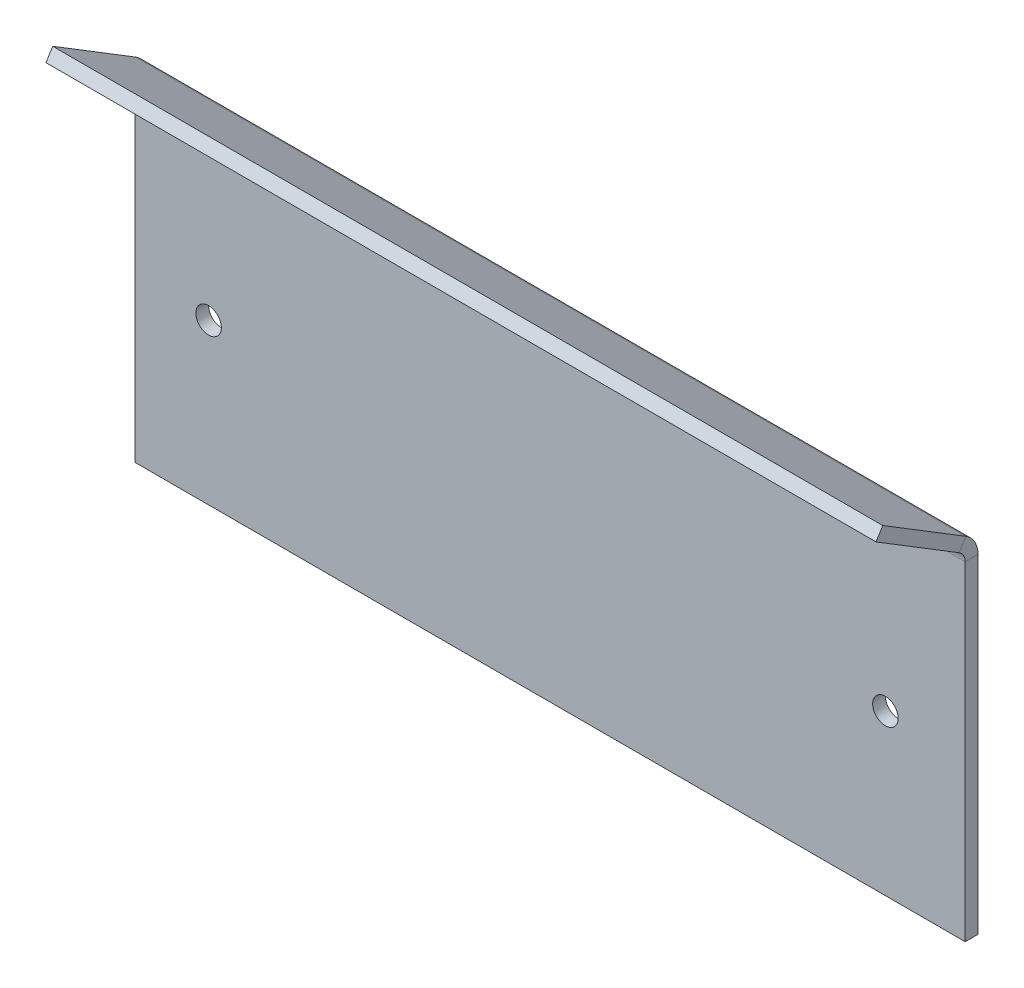
ISO-10303-21;
HEADER;
FILE_DESCRIPTION(('STEP AP214'),'2;1');
FILE_NAME('part.step','',(''),(''),'','','');
FILE_SCHEMA(('AUTOMOTIVE_DESIGN { 1 0 10303 214 1 1 1 1 }'));
ENDSEC;
DATA;
#1=APPLICATION_CONTEXT('core data for automotive mechanical design processes');
#2=APPLICATION_PROTOCOL_DEFINITION('international standard','automotive_design',2000,#1);
#3=PRODUCT_CONTEXT('',#1,'mechanical');
#4=PRODUCT('Part','Part','',(#3));
#5=PRODUCT_RELATED_PRODUCT_CATEGORY('part','',(#4));
#6=PRODUCT_DEFINITION_FORMATION('','',#4);
#7=PRODUCT_DEFINITION_CONTEXT('part definition',#1,'design');
#8=PRODUCT_DEFINITION('design','',#6,#7);
#9=PRODUCT_DEFINITION_SHAPE('','',#8);
#10=(LENGTH_UNIT() NAMED_UNIT(*) SI_UNIT(.MILLI.,.METRE.));
#11=(NAMED_UNIT(*) PLANE_ANGLE_UNIT() SI_UNIT($,.RADIAN.));
#12=(NAMED_UNIT(*) SI_UNIT($,.STERADIAN.) SOLID_ANGLE_UNIT());
#13=UNCERTAINTY_MEASURE_WITH_UNIT(LENGTH_MEASURE(1.E-05),#10,'distance_accuracy_value','');
#14=(GEOMETRIC_REPRESENTATION_CONTEXT(3) GLOBAL_UNCERTAINTY_ASSIGNED_CONTEXT((#13)) GLOBAL_UNIT_ASSIGNED_CONTEXT((#10,
#11,#12)) REPRESENTATION_CONTEXT('',''));
#15=CARTESIAN_POINT('',(0.,0.,0.));
#16=DIRECTION('',(0.,0.,1.));
#17=DIRECTION('',(1.,0.,0.));
#18=AXIS2_PLACEMENT_3D('',#15,#16,#17);
#19=CARTESIAN_POINT('',(-153.944751381215,30.6464088397789,-4.00000000000023));
#20=DIRECTION('',(-1.,0.,0.));
#21=DIRECTION('',(0.,0.,1.));
#22=AXIS2_PLACEMENT_3D('',#19,#20,#21);
#23=PLANE('',#22);
#24=DIRECTION('',(0.,-1.,0.));
#25=VECTOR('',#24,1.);
#26=CARTESIAN_POINT('',(-153.944751381215,30.6464088397789,-2.22044604925031E-13));
#27=LINE('',#26,#25);
#28=CARTESIAN_POINT('',(-153.944751381216,23.7149904194265,8.88178419700125E-13));
#29=VERTEX_POINT('',#28);
#30=CARTESIAN_POINT('',(-153.944751381215,-79.3535911602214,0.));
#31=VERTEX_POINT('',#30);
#32=EDGE_CURVE('E108',#29,#31,#27,.T.);
#33=ORIENTED_EDGE('',*,*,#32,.F.);
#34=DIRECTION('',(0.,0.,-1.));
#35=VECTOR('',#34,1.);
#36=CARTESIAN_POINT('',(-153.944751381216,23.7149904194265,8.88178419700125E-13));
#37=LINE('',#36,#35);
#38=CARTESIAN_POINT('',(-153.944751381216,23.7149904194266,-3.99999999999978));
#39=VERTEX_POINT('',#38);
#40=EDGE_CURVE('E174',#29,#39,#37,.T.);
#41=ORIENTED_EDGE('',*,*,#40,.T.);
#42=DIRECTION('',(0.,-1.,0.));
#43=VECTOR('',#42,1.);
#44=CARTESIAN_POINT('',(-153.944751381215,30.6464088397789,-4.00000000000023));
#45=LINE('',#44,#43);
#46=CARTESIAN_POINT('',(-153.944751381215,-79.3535911602211,-4.));
#47=VERTEX_POINT('',#46);
#48=EDGE_CURVE('E115',#39,#47,#45,.T.);
#49=ORIENTED_EDGE('',*,*,#48,.T.);
#50=DIRECTION('',(0.,0.,1.));
#51=VECTOR('',#50,1.);
#52=CARTESIAN_POINT('',(-153.944751381215,-79.3535911602211,-4.));
#53=LINE('',#52,#51);
#54=EDGE_CURVE('E67',#47,#31,#53,.T.);
#55=ORIENTED_EDGE('',*,*,#54,.T.);
#56=EDGE_LOOP('',(#33,#41,#49,#55));
#57=FACE_BOUND('',#56,.T.);
#58=ADVANCED_FACE('F58',(#57),#23,.T.);
#59=CARTESIAN_POINT('',(0.,-1.11022302462516E-13,-4.));
#60=DIRECTION('',(0.,0.,-1.));
#61=DIRECTION('',(-1.,0.,0.));
#62=AXIS2_PLACEMENT_3D('',#59,#60,#61);
#63=PLANE('',#62);
#64=CARTESIAN_POINT('',(-130.944751381216,-29.2850095805735,-4.));
#65=DIRECTION('',(0.,0.,-1.));
#66=DIRECTION('',(-1.,0.,0.));
#67=AXIS2_PLACEMENT_3D('',#64,#65,#66);
#68=CIRCLE('',#67,3.99999999999999);
#69=CARTESIAN_POINT('',(-134.944751381216,-29.2850095805735,-4.));
#70=VERTEX_POINT('',#69);
#71=EDGE_CURVE('E133',#70,#70,#68,.T.);
#72=ORIENTED_EDGE('',*,*,#71,.F.);
#73=EDGE_LOOP('',(#72));
#74=FACE_BOUND('',#73,.T.);
#75=CARTESIAN_POINT('',(81.0552486187845,-29.2850095805735,-4.));
#76=DIRECTION('',(0.,0.,-1.));
#77=DIRECTION('',(-1.,0.,0.));
#78=AXIS2_PLACEMENT_3D('',#75,#76,#77);
#79=CIRCLE('',#78,4.00000000000001);
#80=CARTESIAN_POINT('',(77.0552486187845,-29.2850095805735,-4.));
#81=VERTEX_POINT('',#80);
#82=EDGE_CURVE('E122',#81,#81,#79,.T.);
#83=ORIENTED_EDGE('',*,*,#82,.F.);
#84=EDGE_LOOP('',(#83));
#85=FACE_BOUND('',#84,.T.);
#86=ORIENTED_EDGE('',*,*,#48,.F.);
#87=DIRECTION('',(-1.,0.,0.));
#88=VECTOR('',#87,1.);
#89=CARTESIAN_POINT('',(-153.944751381216,23.7149904194266,-3.99999999999978));
#90=LINE('',#89,#88);
#91=CARTESIAN_POINT('',(106.055248618785,23.714990419427,-4.));
#92=VERTEX_POINT('',#91);
#93=EDGE_CURVE('E169',#39,#92,#90,.F.);
#94=ORIENTED_EDGE('',*,*,#93,.T.);
#95=DIRECTION('',(0.,1.,0.));
#96=VECTOR('',#95,1.);
#97=CARTESIAN_POINT('',(106.055248618785,30.646408839779,-4.));
#98=LINE('',#97,#96);
#99=CARTESIAN_POINT('',(106.055248618785,-79.353591160221,-4.));
#100=VERTEX_POINT('',#99);
#101=EDGE_CURVE('E113',#100,#92,#98,.T.);
#102=ORIENTED_EDGE('',*,*,#101,.F.);
#103=DIRECTION('',(1.,0.,0.));
#104=VECTOR('',#103,1.);
#105=CARTESIAN_POINT('',(106.055248618785,-79.353591160221,-4.));
#106=LINE('',#105,#104);
#107=EDGE_CURVE('E100',#47,#100,#106,.T.);
#108=ORIENTED_EDGE('',*,*,#107,.F.);
#109=EDGE_LOOP('',(#86,#94,#102,#108));
#110=FACE_BOUND('',#109,.T.);
#111=ADVANCED_FACE('F193',(#74,#85,#110),#63,.T.);
#112=CARTESIAN_POINT('',(0.,0.,0.));
#113=DIRECTION('',(0.,0.,-1.));
#114=DIRECTION('',(-1.,0.,0.));
#115=AXIS2_PLACEMENT_3D('',#112,#113,#114);
#116=PLANE('',#115);
#117=CARTESIAN_POINT('',(-130.944751381216,-29.2850095805735,0.));
#118=DIRECTION('',(0.,0.,-1.));
#119=DIRECTION('',(-1.,0.,0.));
#120=AXIS2_PLACEMENT_3D('',#117,#118,#119);
#121=CIRCLE('',#120,3.99999999999999);
#122=CARTESIAN_POINT('',(-134.944751381216,-29.2850095805735,0.));
#123=VERTEX_POINT('',#122);
#124=EDGE_CURVE('E62',#123,#123,#121,.T.);
#125=ORIENTED_EDGE('',*,*,#124,.T.);
#126=EDGE_LOOP('',(#125));
#127=FACE_BOUND('',#126,.T.);
#128=CARTESIAN_POINT('',(81.0552486187845,-29.2850095805739,0.));
#129=DIRECTION('',(0.,0.,-1.));
#130=DIRECTION('',(-1.,0.,0.));
#131=AXIS2_PLACEMENT_3D('',#128,#129,#130);
#132=CIRCLE('',#131,4.00000000000001);
#133=CARTESIAN_POINT('',(77.0552486187845,-29.2850095805739,0.));
#134=VERTEX_POINT('',#133);
#135=EDGE_CURVE('E119',#134,#134,#132,.T.);
#136=ORIENTED_EDGE('',*,*,#135,.T.);
#137=EDGE_LOOP('',(#136));
#138=FACE_BOUND('',#137,.T.);
#139=DIRECTION('',(-1.,0.,0.));
#140=VECTOR('',#139,1.);
#141=CARTESIAN_POINT('',(-153.944751381216,23.7149904194265,8.88178419700125E-13));
#142=LINE('',#141,#140);
#143=CARTESIAN_POINT('',(106.055248618785,23.7149904194266,0.));
#144=VERTEX_POINT('',#143);
#145=EDGE_CURVE('E180',#29,#144,#142,.F.);
#146=ORIENTED_EDGE('',*,*,#145,.F.);
#147=ORIENTED_EDGE('',*,*,#32,.T.);
#148=DIRECTION('',(1.,0.,0.));
#149=VECTOR('',#148,1.);
#150=CARTESIAN_POINT('',(106.055248618785,-79.353591160221,0.));
#151=LINE('',#150,#149);
#152=CARTESIAN_POINT('',(106.055248618785,-79.353591160221,0.));
#153=VERTEX_POINT('',#152);
#154=EDGE_CURVE('E98',#31,#153,#151,.T.);
#155=ORIENTED_EDGE('',*,*,#154,.T.);
#156=DIRECTION('',(0.,1.,0.));
#157=VECTOR('',#156,1.);
#158=CARTESIAN_POINT('',(106.055248618785,30.6464088397793,0.));
#159=LINE('',#158,#157);
#160=EDGE_CURVE('E103',#153,#144,#159,.T.);
#161=ORIENTED_EDGE('',*,*,#160,.T.);
#162=EDGE_LOOP('',(#146,#147,#155,#161));
#163=FACE_BOUND('',#162,.T.);
#164=ADVANCED_FACE('F110',(#127,#138,#163),#116,.F.);
#165=CARTESIAN_POINT('',(106.055248618785,30.646408839779,-4.));
#166=DIRECTION('',(1.,0.,0.));
#167=DIRECTION('',(0.,1.,0.));
#168=AXIS2_PLACEMENT_3D('',#165,#166,#167);
#169=PLANE('',#168);
#170=DIRECTION('',(0.,0.,-1.));
#171=VECTOR('',#170,1.);
#172=CARTESIAN_POINT('',(106.055248618785,23.7149904194266,0.));
#173=LINE('',#172,#171);
#174=EDGE_CURVE('E105',#144,#92,#173,.T.);
#175=ORIENTED_EDGE('',*,*,#174,.F.);
#176=ORIENTED_EDGE('',*,*,#160,.F.);
#177=DIRECTION('',(0.,0.,1.));
#178=VECTOR('',#177,1.);
#179=CARTESIAN_POINT('',(106.055248618785,-79.353591160221,-4.));
#180=LINE('',#179,#178);
#181=EDGE_CURVE('E13',#100,#153,#180,.T.);
#182=ORIENTED_EDGE('',*,*,#181,.F.);
#183=ORIENTED_EDGE('',*,*,#101,.T.);
#184=EDGE_LOOP('',(#175,#176,#182,#183));
#185=FACE_BOUND('',#184,.T.);
#186=ADVANCED_FACE('F60',(#185),#169,.T.);
#187=CARTESIAN_POINT('',(106.055248618785,-79.353591160221,-4.));
#188=DIRECTION('',(0.,-1.,0.));
#189=DIRECTION('',(1.,0.,0.));
#190=AXIS2_PLACEMENT_3D('',#187,#188,#189);
#191=PLANE('',#190);
#192=ORIENTED_EDGE('',*,*,#154,.F.);
#193=ORIENTED_EDGE('',*,*,#54,.F.);
#194=ORIENTED_EDGE('',*,*,#107,.T.);
#195=ORIENTED_EDGE('',*,*,#181,.T.);
#196=EDGE_LOOP('',(#192,#193,#194,#195));
#197=FACE_BOUND('',#196,.T.);
#198=ADVANCED_FACE('F95',(#197),#191,.T.);
#199=CARTESIAN_POINT('',(106.055248618785,23.7149904194269,4.));
#200=DIRECTION('',(1.,0.,0.));
#201=DIRECTION('',(0.,0.,-1.));
#202=AXIS2_PLACEMENT_3D('',#199,#200,#201);
#203=PLANE('',#202);
#204=DIRECTION('',(0.,0.85264016435409,-0.522498564715952));
#205=VECTOR('',#204,1.);
#206=CARTESIAN_POINT('',(106.055248618785,30.5361117342593,-0.179988517727603));
#207=LINE('',#206,#205);
#208=CARTESIAN_POINT('',(106.055248618785,27.1255510768433,1.91000574113631));
#209=VERTEX_POINT('',#208);
#210=CARTESIAN_POINT('',(106.055248618785,30.5361117342593,-0.179988517727603));
#211=VERTEX_POINT('',#210);
#212=EDGE_CURVE('E121',#209,#211,#207,.T.);
#213=ORIENTED_EDGE('',*,*,#212,.F.);
#214=CARTESIAN_POINT('',(106.055248618785,23.7149904194269,4.));
#215=DIRECTION('',(-1.,0.,0.));
#216=DIRECTION('',(0.,0.,1.));
#217=AXIS2_PLACEMENT_3D('',#214,#215,#216);
#218=CIRCLE('',#217,4.00000000000001);
#219=EDGE_CURVE('E177',#144,#209,#218,.F.);
#220=ORIENTED_EDGE('',*,*,#219,.F.);
#221=ORIENTED_EDGE('',*,*,#174,.T.);
#222=CARTESIAN_POINT('',(106.055248618785,23.7149904194269,4.));
#223=DIRECTION('',(-1.,0.,0.));
#224=DIRECTION('',(0.,0.,1.));
#225=AXIS2_PLACEMENT_3D('',#222,#223,#224);
#226=CIRCLE('',#225,8.00000000000001);
#227=EDGE_CURVE('E75',#92,#211,#226,.F.);
#228=ORIENTED_EDGE('',*,*,#227,.T.);
#229=EDGE_LOOP('',(#213,#220,#221,#228));
#230=FACE_BOUND('',#229,.T.);
#231=ADVANCED_FACE('F243',(#230),#203,.T.);
#232=CARTESIAN_POINT('',(-153.944751381216,23.7149904194266,4.00000000000089));
#233=DIRECTION('',(1.,0.,0.));
#234=DIRECTION('',(0.,0.,-1.));
#235=AXIS2_PLACEMENT_3D('',#232,#233,#234);
#236=PLANE('',#235);
#237=CARTESIAN_POINT('',(-153.944751381216,23.7149904194266,4.00000000000089));
#238=DIRECTION('',(-1.,0.,0.));
#239=DIRECTION('',(0.,0.,1.));
#240=AXIS2_PLACEMENT_3D('',#237,#238,#239);
#241=CIRCLE('',#240,4.00000000000001);
#242=CARTESIAN_POINT('',(-153.944751381215,27.125551076843,1.91000574113631));
#243=VERTEX_POINT('',#242);
#244=EDGE_CURVE('E139',#243,#29,#241,.T.);
#245=ORIENTED_EDGE('',*,*,#244,.F.);
#246=DIRECTION('',(0.,0.85264016435409,-0.522498564715952));
#247=VECTOR('',#246,1.);
#248=CARTESIAN_POINT('',(-153.944751381215,27.125551076843,1.91000574113631));
#249=LINE('',#248,#247);
#250=CARTESIAN_POINT('',(-153.944751381215,30.5361117342593,-0.179988517727603));
#251=VERTEX_POINT('',#250);
#252=EDGE_CURVE('E164',#243,#251,#249,.T.);
#253=ORIENTED_EDGE('',*,*,#252,.T.);
#254=CARTESIAN_POINT('',(-153.944751381216,23.7149904194266,4.00000000000089));
#255=DIRECTION('',(-1.,0.,0.));
#256=DIRECTION('',(0.,0.,1.));
#257=AXIS2_PLACEMENT_3D('',#254,#255,#256);
#258=CIRCLE('',#257,8.00000000000001);
#259=EDGE_CURVE('E172',#251,#39,#258,.T.);
#260=ORIENTED_EDGE('',*,*,#259,.T.);
#261=ORIENTED_EDGE('',*,*,#40,.F.);
#262=EDGE_LOOP('',(#245,#253,#260,#261));
#263=FACE_BOUND('',#262,.T.);
#264=ADVANCED_FACE('F201',(#263),#236,.F.);
#265=CARTESIAN_POINT('',(-153.944751381216,23.7149904194266,4.00000000000089));
#266=DIRECTION('',(-1.,0.,0.));
#267=DIRECTION('',(0.,0.85264016435409,-0.522498564715952));
#268=AXIS2_PLACEMENT_3D('',#265,#266,#267);
#269=CYLINDRICAL_SURFACE('',#268,8.00000000000001);
#270=ORIENTED_EDGE('',*,*,#93,.F.);
#271=ORIENTED_EDGE('',*,*,#259,.F.);
#272=DIRECTION('',(-1.,0.,0.));
#273=VECTOR('',#272,1.);
#274=CARTESIAN_POINT('',(0.,30.5361117342593,-0.179988517727603));
#275=LINE('',#274,#273);
#276=EDGE_CURVE('E161',#211,#251,#275,.T.);
#277=ORIENTED_EDGE('',*,*,#276,.F.);
#278=ORIENTED_EDGE('',*,*,#227,.F.);
#279=EDGE_LOOP('',(#270,#271,#277,#278));
#280=FACE_BOUND('',#279,.T.);
#281=ADVANCED_FACE('F195',(#280),#269,.T.);
#282=CARTESIAN_POINT('',(-153.944751381216,23.7149904194266,4.00000000000089));
#283=DIRECTION('',(-1.,0.,0.));
#284=DIRECTION('',(0.,0.85264016435409,-0.522498564715952));
#285=AXIS2_PLACEMENT_3D('',#282,#283,#284);
#286=CYLINDRICAL_SURFACE('',#285,4.00000000000001);
#287=ORIENTED_EDGE('',*,*,#145,.T.);
#288=ORIENTED_EDGE('',*,*,#219,.T.);
#289=DIRECTION('',(1.,0.,0.));
#290=VECTOR('',#289,1.);
#291=CARTESIAN_POINT('',(106.055248618785,27.1255510768433,1.91000574113631));
#292=LINE('',#291,#290);
#293=EDGE_CURVE('E126',#209,#243,#292,.F.);
#294=ORIENTED_EDGE('',*,*,#293,.T.);
#295=ORIENTED_EDGE('',*,*,#244,.T.);
#296=EDGE_LOOP('',(#287,#288,#294,#295));
#297=FACE_BOUND('',#296,.T.);
#298=ADVANCED_FACE('F236',(#297),#286,.F.);
#299=CARTESIAN_POINT('',(-153.944751381215,29.3656587107389,-2.08999425886391));
#300=DIRECTION('',(-1.,0.,0.));
#301=DIRECTION('',(0.,-1.,0.));
#302=AXIS2_PLACEMENT_3D('',#299,#300,#301);
#303=PLANE('',#302);
#304=DIRECTION('',(0.,-0.522498564715952,-0.85264016435409));
#305=VECTOR('',#304,1.);
#306=CARTESIAN_POINT('',(-153.944751381215,29.3656587107389,-2.08999425886391));
#307=LINE('',#306,#305);
#308=CARTESIAN_POINT('',(-153.944751381215,46.4826554522776,25.8424057523932));
#309=VERTEX_POINT('',#308);
#310=EDGE_CURVE('E143',#309,#251,#307,.T.);
#311=ORIENTED_EDGE('',*,*,#310,.T.);
#312=ORIENTED_EDGE('',*,*,#252,.F.);
#313=DIRECTION('',(0.,0.522498564715952,0.85264016435409));
#314=VECTOR('',#313,1.);
#315=CARTESIAN_POINT('',(-153.944751381215,17.5884828656301,-13.6530751095936));
#316=LINE('',#315,#314);
#317=CARTESIAN_POINT('',(-153.944751381216,43.0720947948612,27.9324000112571));
#318=VERTEX_POINT('',#317);
#319=EDGE_CURVE('E152',#318,#243,#316,.F.);
#320=ORIENTED_EDGE('',*,*,#319,.F.);
#321=DIRECTION('',(0.,-0.85264016435409,0.522498564715952));
#322=VECTOR('',#321,1.);
#323=CARTESIAN_POINT('',(-153.944751381215,46.4826554522775,25.8424057523932));
#324=LINE('',#323,#322);
#325=EDGE_CURVE('E136',#309,#318,#324,.T.);
#326=ORIENTED_EDGE('',*,*,#325,.F.);
#327=EDGE_LOOP('',(#311,#312,#320,#326));
#328=FACE_BOUND('',#327,.T.);
#329=ADVANCED_FACE('F216',(#328),#303,.T.);
#330=CARTESIAN_POINT('',(106.055248618785,46.4826554522779,25.8424057523932));
#331=DIRECTION('',(1.,0.,0.));
#332=DIRECTION('',(0.,1.,0.));
#333=AXIS2_PLACEMENT_3D('',#330,#331,#332);
#334=PLANE('',#333);
#335=DIRECTION('',(0.,-0.522498564715952,-0.85264016435409));
#336=VECTOR('',#335,1.);
#337=CARTESIAN_POINT('',(106.055248618784,17.5884828656302,-13.6530751095938));
#338=LINE('',#337,#336);
#339=CARTESIAN_POINT('',(106.055248618785,43.0720947948612,27.9324000112571));
#340=VERTEX_POINT('',#339);
#341=EDGE_CURVE('E158',#209,#340,#338,.F.);
#342=ORIENTED_EDGE('',*,*,#341,.F.);
#343=ORIENTED_EDGE('',*,*,#212,.T.);
#344=DIRECTION('',(0.,0.522498564715952,0.85264016435409));
#345=VECTOR('',#344,1.);
#346=CARTESIAN_POINT('',(106.055248618785,46.4826554522779,25.8424057523932));
#347=LINE('',#346,#345);
#348=CARTESIAN_POINT('',(106.055248618785,46.4826554522779,25.8424057523932));
#349=VERTEX_POINT('',#348);
#350=EDGE_CURVE('E149',#211,#349,#347,.T.);
#351=ORIENTED_EDGE('',*,*,#350,.T.);
#352=DIRECTION('',(0.,-0.85264016435409,0.522498564715952));
#353=VECTOR('',#352,1.);
#354=CARTESIAN_POINT('',(106.055248618785,46.4826554522779,25.8424057523932));
#355=LINE('',#354,#353);
#356=EDGE_CURVE('E140',#349,#340,#355,.T.);
#357=ORIENTED_EDGE('',*,*,#356,.T.);
#358=EDGE_LOOP('',(#342,#343,#351,#357));
#359=FACE_BOUND('',#358,.T.);
#360=ADVANCED_FACE('F241',(#359),#334,.T.);
#361=CARTESIAN_POINT('',(0.,20.9990435230462,-15.7430693684575));
#362=DIRECTION('',(0.,0.85264016435409,-0.522498564715952));
#363=DIRECTION('',(0.,0.522498564715952,0.85264016435409));
#364=AXIS2_PLACEMENT_3D('',#361,#362,#363);
#365=PLANE('',#364);
#366=ORIENTED_EDGE('',*,*,#350,.F.);
#367=ORIENTED_EDGE('',*,*,#276,.T.);
#368=ORIENTED_EDGE('',*,*,#310,.F.);
#369=DIRECTION('',(-1.,0.,0.));
#370=VECTOR('',#369,1.);
#371=CARTESIAN_POINT('',(-153.944751381215,46.4826554522775,25.8424057523932));
#372=LINE('',#371,#370);
#373=EDGE_CURVE('E146',#349,#309,#372,.T.);
#374=ORIENTED_EDGE('',*,*,#373,.F.);
#375=EDGE_LOOP('',(#366,#367,#368,#374));
#376=FACE_BOUND('',#375,.T.);
#377=ADVANCED_FACE('F213',(#376),#365,.T.);
#378=CARTESIAN_POINT('',(0.,17.5884828656301,-13.6530751095936));
#379=DIRECTION('',(0.,0.85264016435409,-0.522498564715952));
#380=DIRECTION('',(0.,0.522498564715952,0.85264016435409));
#381=AXIS2_PLACEMENT_3D('',#378,#379,#380);
#382=PLANE('',#381);
#383=ORIENTED_EDGE('',*,*,#293,.F.);
#384=ORIENTED_EDGE('',*,*,#341,.T.);
#385=DIRECTION('',(1.,0.,0.));
#386=VECTOR('',#385,1.);
#387=CARTESIAN_POINT('',(0.,43.0720947948612,27.9324000112571));
#388=LINE('',#387,#386);
#389=EDGE_CURVE('E155',#340,#318,#388,.F.);
#390=ORIENTED_EDGE('',*,*,#389,.T.);
#391=ORIENTED_EDGE('',*,*,#319,.T.);
#392=EDGE_LOOP('',(#383,#384,#390,#391));
#393=FACE_BOUND('',#392,.T.);
#394=ADVANCED_FACE('F240',(#393),#382,.F.);
#395=CARTESIAN_POINT('',(-153.944751381215,46.4826554522775,25.8424057523932));
#396=DIRECTION('',(0.,0.522498564715953,0.85264016435409));
#397=DIRECTION('',(0.,-0.85264016435409,0.522498564715952));
#398=AXIS2_PLACEMENT_3D('',#395,#396,#397);
#399=PLANE('',#398);
#400=ORIENTED_EDGE('',*,*,#389,.F.);
#401=ORIENTED_EDGE('',*,*,#356,.F.);
#402=ORIENTED_EDGE('',*,*,#373,.T.);
#403=ORIENTED_EDGE('',*,*,#325,.T.);
#404=EDGE_LOOP('',(#400,#401,#402,#403));
#405=FACE_BOUND('',#404,.T.);
#406=ADVANCED_FACE('F223',(#405),#399,.T.);
#407=CARTESIAN_POINT('',(81.0552486187845,-29.2850095805731,27.9324000112575));
#408=DIRECTION('',(0.,0.,-1.));
#409=DIRECTION('',(-1.,0.,0.));
#410=AXIS2_PLACEMENT_3D('',#407,#408,#409);
#411=CYLINDRICAL_SURFACE('',#410,4.00000000000001);
#412=ORIENTED_EDGE('',*,*,#82,.T.);
#413=EDGE_LOOP('',(#412));
#414=FACE_BOUND('',#413,.T.);
#415=ORIENTED_EDGE('',*,*,#135,.F.);
#416=EDGE_LOOP('',(#415));
#417=FACE_BOUND('',#416,.T.);
#418=ADVANCED_FACE('F269',(#414,#417),#411,.F.);
#419=CARTESIAN_POINT('',(-130.944751381216,-29.2850095805731,27.9324000112575));
#420=DIRECTION('',(0.,0.,-1.));
#421=DIRECTION('',(-1.,0.,0.));
#422=AXIS2_PLACEMENT_3D('',#419,#420,#421);
#423=CYLINDRICAL_SURFACE('',#422,3.99999999999999);
#424=ORIENTED_EDGE('',*,*,#71,.T.);
#425=EDGE_LOOP('',(#424));
#426=FACE_BOUND('',#425,.T.);
#427=ORIENTED_EDGE('',*,*,#124,.F.);
#428=EDGE_LOOP('',(#427));
#429=FACE_BOUND('',#428,.T.);
#430=ADVANCED_FACE('F267',(#426,#429),#423,.F.);
#431=CLOSED_SHELL('',(#58,#111,#164,#186,#198,#231,#264,#281,#298,#329,#360,#377,#394,#406,#418,#430));
#432=MANIFOLD_SOLID_BREP('B2',#431);
#433=ADVANCED_BREP_SHAPE_REPRESENTATION('',(#18,#432),#14);
#434=SHAPE_DEFINITION_REPRESENTATION(#9,#433);
ENDSEC;
END-ISO-10303-21;
